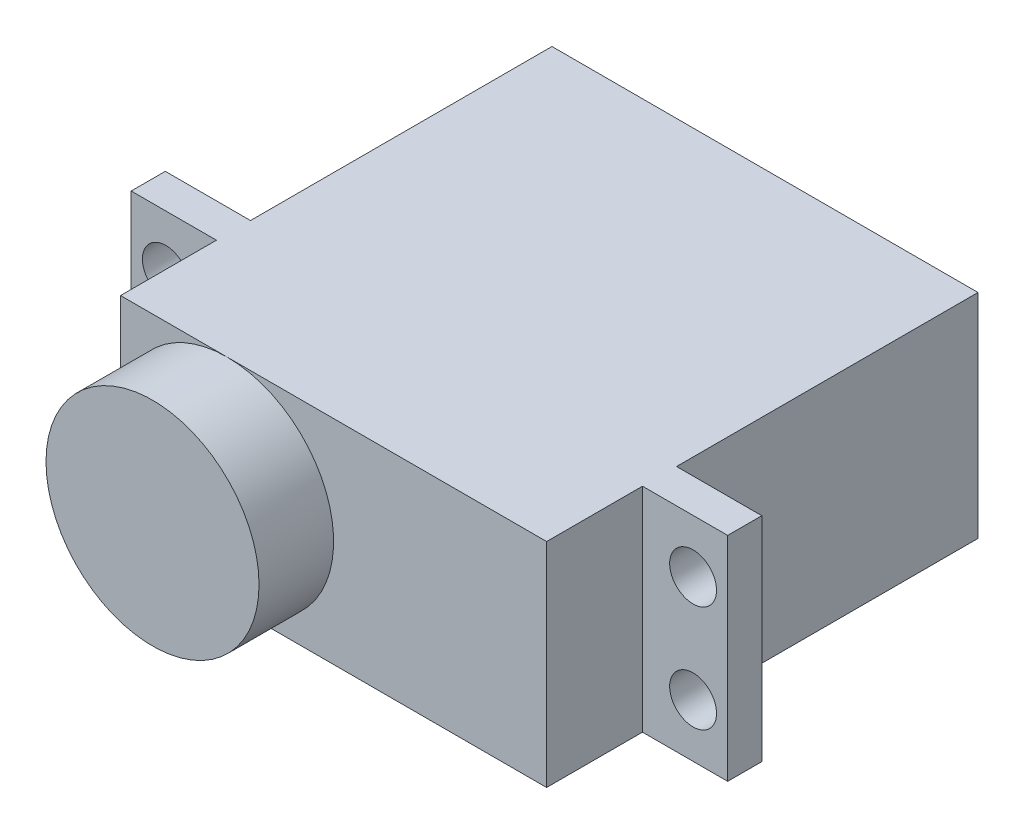
ISO-10303-21;
HEADER;
FILE_DESCRIPTION(('STEP AP214'),'2;1');
FILE_NAME('part.step','',(''),(''),'','','');
FILE_SCHEMA(('AUTOMOTIVE_DESIGN { 1 0 10303 214 1 1 1 1 }'));
ENDSEC;
DATA;
#1=APPLICATION_CONTEXT('core data for automotive mechanical design processes');
#2=APPLICATION_PROTOCOL_DEFINITION('international standard','automotive_design',2000,#1);
#3=PRODUCT_CONTEXT('',#1,'mechanical');
#4=PRODUCT('Part','Part','',(#3));
#5=PRODUCT_RELATED_PRODUCT_CATEGORY('part','',(#4));
#6=PRODUCT_DEFINITION_FORMATION('','',#4);
#7=PRODUCT_DEFINITION_CONTEXT('part definition',#1,'design');
#8=PRODUCT_DEFINITION('design','',#6,#7);
#9=PRODUCT_DEFINITION_SHAPE('','',#8);
#10=(LENGTH_UNIT() NAMED_UNIT(*) SI_UNIT(.MILLI.,.METRE.));
#11=(NAMED_UNIT(*) PLANE_ANGLE_UNIT() SI_UNIT($,.RADIAN.));
#12=(NAMED_UNIT(*) SI_UNIT($,.STERADIAN.) SOLID_ANGLE_UNIT());
#13=UNCERTAINTY_MEASURE_WITH_UNIT(LENGTH_MEASURE(1.E-05),#10,'distance_accuracy_value','');
#14=(GEOMETRIC_REPRESENTATION_CONTEXT(3) GLOBAL_UNCERTAINTY_ASSIGNED_CONTEXT((#13)) GLOBAL_UNIT_ASSIGNED_CONTEXT((#10,
#11,#12)) REPRESENTATION_CONTEXT('',''));
#15=CARTESIAN_POINT('',(0.,0.,0.));
#16=DIRECTION('',(0.,0.,1.));
#17=DIRECTION('',(1.,0.,0.));
#18=AXIS2_PLACEMENT_3D('',#15,#16,#17);
#19=CARTESIAN_POINT('',(20.,10.,-40.5));
#20=DIRECTION('',(-1.,0.,0.));
#21=DIRECTION('',(0.,0.,1.));
#22=AXIS2_PLACEMENT_3D('',#19,#20,#21);
#23=PLANE('',#22);
#24=DIRECTION('',(0.,-1.,0.));
#25=VECTOR('',#24,1.);
#26=CARTESIAN_POINT('',(20.,10.,-9.));
#27=LINE('',#26,#25);
#28=CARTESIAN_POINT('',(20.,10.,-9.));
#29=VERTEX_POINT('',#28);
#30=CARTESIAN_POINT('',(20.,-10.,-9.));
#31=VERTEX_POINT('',#30);
#32=EDGE_CURVE('E57',#29,#31,#27,.T.);
#33=ORIENTED_EDGE('',*,*,#32,.F.);
#34=DIRECTION('',(0.,0.,1.));
#35=VECTOR('',#34,1.);
#36=CARTESIAN_POINT('',(20.,10.,-40.5));
#37=LINE('',#36,#35);
#38=CARTESIAN_POINT('',(20.,10.,0.));
#39=VERTEX_POINT('',#38);
#40=EDGE_CURVE('E241',#29,#39,#37,.T.);
#41=ORIENTED_EDGE('',*,*,#40,.T.);
#42=DIRECTION('',(0.,-1.,0.));
#43=VECTOR('',#42,1.);
#44=CARTESIAN_POINT('',(20.,10.,0.));
#45=LINE('',#44,#43);
#46=CARTESIAN_POINT('',(20.,-10.,0.));
#47=VERTEX_POINT('',#46);
#48=EDGE_CURVE('E231',#39,#47,#45,.T.);
#49=ORIENTED_EDGE('',*,*,#48,.T.);
#50=DIRECTION('',(0.,0.,1.));
#51=VECTOR('',#50,1.);
#52=CARTESIAN_POINT('',(20.,-10.,-40.5));
#53=LINE('',#52,#51);
#54=EDGE_CURVE('E245',#31,#47,#53,.T.);
#55=ORIENTED_EDGE('',*,*,#54,.F.);
#56=EDGE_LOOP('',(#33,#41,#49,#55));
#57=FACE_BOUND('',#56,.T.);
#58=ADVANCED_FACE('F39',(#57),#23,.F.);
#59=CARTESIAN_POINT('',(-20.,10.,-40.5));
#60=DIRECTION('',(-1.,0.,0.));
#61=DIRECTION('',(0.,-1.,0.));
#62=AXIS2_PLACEMENT_3D('',#59,#60,#61);
#63=PLANE('',#62);
#64=DIRECTION('',(0.,0.,1.));
#65=VECTOR('',#64,1.);
#66=CARTESIAN_POINT('',(-20.,-10.,-40.5));
#67=LINE('',#66,#65);
#68=CARTESIAN_POINT('',(-20.,-10.,-40.5));
#69=VERTEX_POINT('',#68);
#70=CARTESIAN_POINT('',(-20.,-10.,-12.2));
#71=VERTEX_POINT('',#70);
#72=EDGE_CURVE('E246',#69,#71,#67,.T.);
#73=ORIENTED_EDGE('',*,*,#72,.T.);
#74=DIRECTION('',(0.,-1.,0.));
#75=VECTOR('',#74,1.);
#76=CARTESIAN_POINT('',(-20.,10.,-12.2));
#77=LINE('',#76,#75);
#78=CARTESIAN_POINT('',(-20.,10.,-12.2));
#79=VERTEX_POINT('',#78);
#80=EDGE_CURVE('E184',#79,#71,#77,.T.);
#81=ORIENTED_EDGE('',*,*,#80,.F.);
#82=DIRECTION('',(0.,0.,1.));
#83=VECTOR('',#82,1.);
#84=CARTESIAN_POINT('',(-20.,10.,-40.5));
#85=LINE('',#84,#83);
#86=CARTESIAN_POINT('',(-20.,10.,-40.5));
#87=VERTEX_POINT('',#86);
#88=EDGE_CURVE('E236',#87,#79,#85,.T.);
#89=ORIENTED_EDGE('',*,*,#88,.F.);
#90=DIRECTION('',(0.,-1.,0.));
#91=VECTOR('',#90,1.);
#92=CARTESIAN_POINT('',(-20.,10.,-40.5));
#93=LINE('',#92,#91);
#94=EDGE_CURVE('E212',#87,#69,#93,.T.);
#95=ORIENTED_EDGE('',*,*,#94,.T.);
#96=EDGE_LOOP('',(#73,#81,#89,#95));
#97=FACE_BOUND('',#96,.T.);
#98=ADVANCED_FACE('F326',(#97),#63,.T.);
#99=CARTESIAN_POINT('',(0.,0.,0.));
#100=DIRECTION('',(0.,0.,1.));
#101=DIRECTION('',(1.,0.,0.));
#102=AXIS2_PLACEMENT_3D('',#99,#100,#101);
#103=PLANE('',#102);
#104=CARTESIAN_POINT('',(-10.,0.,0.));
#105=DIRECTION('',(0.,0.,1.));
#106=DIRECTION('',(1.,0.,0.));
#107=AXIS2_PLACEMENT_3D('',#104,#105,#106);
#108=CIRCLE('',#107,10.);
#109=CARTESIAN_POINT('',(-10.,10.,0.));
#110=VERTEX_POINT('',#109);
#111=CARTESIAN_POINT('',(-20.,0.,0.));
#112=VERTEX_POINT('',#111);
#113=EDGE_CURVE('E50',#110,#112,#108,.T.);
#114=ORIENTED_EDGE('',*,*,#113,.F.);
#115=DIRECTION('',(1.,0.,0.));
#116=VECTOR('',#115,1.);
#117=CARTESIAN_POINT('',(-20.,10.,0.));
#118=LINE('',#117,#116);
#119=CARTESIAN_POINT('',(-20.,10.,0.));
#120=VERTEX_POINT('',#119);
#121=EDGE_CURVE('E216',#120,#110,#118,.T.);
#122=ORIENTED_EDGE('',*,*,#121,.F.);
#123=DIRECTION('',(0.,-1.,0.));
#124=VECTOR('',#123,1.);
#125=CARTESIAN_POINT('',(-20.,10.,0.));
#126=LINE('',#125,#124);
#127=EDGE_CURVE('E224',#120,#112,#126,.T.);
#128=ORIENTED_EDGE('',*,*,#127,.T.);
#129=EDGE_LOOP('',(#114,#122,#128));
#130=FACE_BOUND('',#129,.T.);
#131=ADVANCED_FACE('F308',(#130),#103,.T.);
#132=CARTESIAN_POINT('',(-10.,-10.,0.));
#133=VERTEX_POINT('',#132);
#134=EDGE_CURVE('E11',#112,#133,#108,.T.);
#135=ORIENTED_EDGE('',*,*,#134,.F.);
#136=CARTESIAN_POINT('',(-20.,-10.,0.));
#137=VERTEX_POINT('',#136);
#138=EDGE_CURVE('E209',#112,#137,#126,.T.);
#139=ORIENTED_EDGE('',*,*,#138,.T.);
#140=DIRECTION('',(1.,0.,0.));
#141=VECTOR('',#140,1.);
#142=CARTESIAN_POINT('',(-20.,-10.,0.));
#143=LINE('',#142,#141);
#144=EDGE_CURVE('E228',#137,#133,#143,.T.);
#145=ORIENTED_EDGE('',*,*,#144,.T.);
#146=EDGE_LOOP('',(#135,#139,#145));
#147=FACE_BOUND('',#146,.T.);
#148=ADVANCED_FACE('F302',(#147),#103,.T.);
#149=DIRECTION('',(0.,-1.,0.));
#150=VECTOR('',#149,1.);
#151=CARTESIAN_POINT('',(-20.,10.,-9.));
#152=LINE('',#151,#150);
#153=CARTESIAN_POINT('',(-20.,10.,-9.));
#154=VERTEX_POINT('',#153);
#155=CARTESIAN_POINT('',(-20.,-10.,-9.));
#156=VERTEX_POINT('',#155);
#157=EDGE_CURVE('E175',#154,#156,#152,.T.);
#158=ORIENTED_EDGE('',*,*,#157,.T.);
#159=EDGE_CURVE('E223',#156,#137,#67,.T.);
#160=ORIENTED_EDGE('',*,*,#159,.T.);
#161=ORIENTED_EDGE('',*,*,#138,.F.);
#162=ORIENTED_EDGE('',*,*,#127,.F.);
#163=EDGE_CURVE('E239',#154,#120,#85,.T.);
#164=ORIENTED_EDGE('',*,*,#163,.F.);
#165=EDGE_LOOP('',(#158,#160,#161,#162,#164));
#166=FACE_BOUND('',#165,.T.);
#167=ADVANCED_FACE('F41',(#166),#63,.T.);
#168=CARTESIAN_POINT('',(-20.,10.,-40.5));
#169=DIRECTION('',(0.,-1.,0.));
#170=DIRECTION('',(0.,0.,-1.));
#171=AXIS2_PLACEMENT_3D('',#168,#169,#170);
#172=PLANE('',#171);
#173=ORIENTED_EDGE('',*,*,#121,.T.);
#174=EDGE_CURVE('E234',#110,#39,#118,.T.);
#175=ORIENTED_EDGE('',*,*,#174,.T.);
#176=ORIENTED_EDGE('',*,*,#40,.F.);
#177=DIRECTION('',(-1.,0.,0.));
#178=VECTOR('',#177,1.);
#179=CARTESIAN_POINT('',(28.,10.,-9.));
#180=LINE('',#179,#178);
#181=CARTESIAN_POINT('',(28.,10.,-9.));
#182=VERTEX_POINT('',#181);
#183=EDGE_CURVE('E162',#182,#29,#180,.T.);
#184=ORIENTED_EDGE('',*,*,#183,.F.);
#185=DIRECTION('',(0.,0.,-1.));
#186=VECTOR('',#185,1.);
#187=CARTESIAN_POINT('',(28.,10.,-9.));
#188=LINE('',#187,#186);
#189=CARTESIAN_POINT('',(28.,10.,-12.2));
#190=VERTEX_POINT('',#189);
#191=EDGE_CURVE('E155',#182,#190,#188,.T.);
#192=ORIENTED_EDGE('',*,*,#191,.T.);
#193=DIRECTION('',(-1.,0.,0.));
#194=VECTOR('',#193,1.);
#195=CARTESIAN_POINT('',(28.,10.,-12.2));
#196=LINE('',#195,#194);
#197=CARTESIAN_POINT('',(20.,10.,-12.2));
#198=VERTEX_POINT('',#197);
#199=EDGE_CURVE('E141',#190,#198,#196,.T.);
#200=ORIENTED_EDGE('',*,*,#199,.T.);
#201=CARTESIAN_POINT('',(20.,10.,-40.5));
#202=VERTEX_POINT('',#201);
#203=EDGE_CURVE('E65',#202,#198,#37,.T.);
#204=ORIENTED_EDGE('',*,*,#203,.F.);
#205=DIRECTION('',(1.,0.,0.));
#206=VECTOR('',#205,1.);
#207=CARTESIAN_POINT('',(-20.,10.,-40.5));
#208=LINE('',#207,#206);
#209=EDGE_CURVE('E221',#87,#202,#208,.T.);
#210=ORIENTED_EDGE('',*,*,#209,.F.);
#211=ORIENTED_EDGE('',*,*,#88,.T.);
#212=DIRECTION('',(1.,0.,0.));
#213=VECTOR('',#212,1.);
#214=CARTESIAN_POINT('',(-28.,10.,-12.2));
#215=LINE('',#214,#213);
#216=CARTESIAN_POINT('',(-28.,10.,-12.2));
#217=VERTEX_POINT('',#216);
#218=EDGE_CURVE('E199',#217,#79,#215,.T.);
#219=ORIENTED_EDGE('',*,*,#218,.F.);
#220=DIRECTION('',(0.,0.,-1.));
#221=VECTOR('',#220,1.);
#222=CARTESIAN_POINT('',(-28.,10.,-9.));
#223=LINE('',#222,#221);
#224=CARTESIAN_POINT('',(-28.,10.,-9.));
#225=VERTEX_POINT('',#224);
#226=EDGE_CURVE('E189',#225,#217,#223,.T.);
#227=ORIENTED_EDGE('',*,*,#226,.F.);
#228=DIRECTION('',(1.,0.,0.));
#229=VECTOR('',#228,1.);
#230=CARTESIAN_POINT('',(-28.,10.,-9.));
#231=LINE('',#230,#229);
#232=EDGE_CURVE('E196',#225,#154,#231,.T.);
#233=ORIENTED_EDGE('',*,*,#232,.T.);
#234=ORIENTED_EDGE('',*,*,#163,.T.);
#235=EDGE_LOOP('',(#173,#175,#176,#184,#192,#200,#204,#210,#211,#219,#227,#233,#234));
#236=FACE_BOUND('',#235,.T.);
#237=ADVANCED_FACE('F160',(#236),#172,.F.);
#238=ORIENTED_EDGE('',*,*,#203,.T.);
#239=DIRECTION('',(0.,-1.,0.));
#240=VECTOR('',#239,1.);
#241=CARTESIAN_POINT('',(20.,10.,-12.2));
#242=LINE('',#241,#240);
#243=CARTESIAN_POINT('',(20.,-10.,-12.2));
#244=VERTEX_POINT('',#243);
#245=EDGE_CURVE('E146',#198,#244,#242,.T.);
#246=ORIENTED_EDGE('',*,*,#245,.T.);
#247=CARTESIAN_POINT('',(20.,-10.,-40.5));
#248=VERTEX_POINT('',#247);
#249=EDGE_CURVE('E242',#248,#244,#53,.T.);
#250=ORIENTED_EDGE('',*,*,#249,.F.);
#251=DIRECTION('',(0.,-1.,0.));
#252=VECTOR('',#251,1.);
#253=CARTESIAN_POINT('',(20.,10.,-40.5));
#254=LINE('',#253,#252);
#255=EDGE_CURVE('E219',#202,#248,#254,.T.);
#256=ORIENTED_EDGE('',*,*,#255,.F.);
#257=EDGE_LOOP('',(#238,#246,#250,#256));
#258=FACE_BOUND('',#257,.T.);
#259=ADVANCED_FACE('F319',(#258),#23,.F.);
#260=CARTESIAN_POINT('',(-20.,-10.,-40.5));
#261=DIRECTION('',(0.,-1.,0.));
#262=DIRECTION('',(0.,0.,-1.));
#263=AXIS2_PLACEMENT_3D('',#260,#261,#262);
#264=PLANE('',#263);
#265=ORIENTED_EDGE('',*,*,#144,.F.);
#266=ORIENTED_EDGE('',*,*,#159,.F.);
#267=DIRECTION('',(1.,0.,0.));
#268=VECTOR('',#267,1.);
#269=CARTESIAN_POINT('',(-28.,-10.,-9.));
#270=LINE('',#269,#268);
#271=CARTESIAN_POINT('',(-28.,-10.,-9.));
#272=VERTEX_POINT('',#271);
#273=EDGE_CURVE('E191',#272,#156,#270,.T.);
#274=ORIENTED_EDGE('',*,*,#273,.F.);
#275=DIRECTION('',(0.,0.,-1.));
#276=VECTOR('',#275,1.);
#277=CARTESIAN_POINT('',(-28.,-10.,-9.));
#278=LINE('',#277,#276);
#279=CARTESIAN_POINT('',(-28.,-10.,-12.2));
#280=VERTEX_POINT('',#279);
#281=EDGE_CURVE('E183',#272,#280,#278,.T.);
#282=ORIENTED_EDGE('',*,*,#281,.T.);
#283=DIRECTION('',(1.,0.,0.));
#284=VECTOR('',#283,1.);
#285=CARTESIAN_POINT('',(-28.,-10.,-12.2));
#286=LINE('',#285,#284);
#287=EDGE_CURVE('E202',#280,#71,#286,.T.);
#288=ORIENTED_EDGE('',*,*,#287,.T.);
#289=ORIENTED_EDGE('',*,*,#72,.F.);
#290=DIRECTION('',(1.,0.,0.));
#291=VECTOR('',#290,1.);
#292=CARTESIAN_POINT('',(-20.,-10.,-40.5));
#293=LINE('',#292,#291);
#294=EDGE_CURVE('E215',#69,#248,#293,.T.);
#295=ORIENTED_EDGE('',*,*,#294,.T.);
#296=ORIENTED_EDGE('',*,*,#249,.T.);
#297=DIRECTION('',(-1.,0.,0.));
#298=VECTOR('',#297,1.);
#299=CARTESIAN_POINT('',(28.,-10.,-12.2));
#300=LINE('',#299,#298);
#301=CARTESIAN_POINT('',(28.,-10.,-12.2));
#302=VERTEX_POINT('',#301);
#303=EDGE_CURVE('E149',#302,#244,#300,.T.);
#304=ORIENTED_EDGE('',*,*,#303,.F.);
#305=DIRECTION('',(0.,0.,-1.));
#306=VECTOR('',#305,1.);
#307=CARTESIAN_POINT('',(28.,-10.,-9.));
#308=LINE('',#307,#306);
#309=CARTESIAN_POINT('',(28.,-10.,-9.));
#310=VERTEX_POINT('',#309);
#311=EDGE_CURVE('E157',#310,#302,#308,.T.);
#312=ORIENTED_EDGE('',*,*,#311,.F.);
#313=DIRECTION('',(-1.,0.,0.));
#314=VECTOR('',#313,1.);
#315=CARTESIAN_POINT('',(28.,-10.,-9.));
#316=LINE('',#315,#314);
#317=EDGE_CURVE('E176',#310,#31,#316,.T.);
#318=ORIENTED_EDGE('',*,*,#317,.T.);
#319=ORIENTED_EDGE('',*,*,#54,.T.);
#320=EDGE_CURVE('E227',#133,#47,#143,.T.);
#321=ORIENTED_EDGE('',*,*,#320,.F.);
#322=EDGE_LOOP('',(#265,#266,#274,#282,#288,#289,#295,#296,#304,#312,#318,#319,#321));
#323=FACE_BOUND('',#322,.T.);
#324=ADVANCED_FACE('F298',(#323),#264,.T.);
#325=CARTESIAN_POINT('',(0.,0.,-40.5));
#326=DIRECTION('',(0.,0.,1.));
#327=DIRECTION('',(1.,0.,0.));
#328=AXIS2_PLACEMENT_3D('',#325,#326,#327);
#329=PLANE('',#328);
#330=ORIENTED_EDGE('',*,*,#94,.F.);
#331=ORIENTED_EDGE('',*,*,#209,.T.);
#332=ORIENTED_EDGE('',*,*,#255,.T.);
#333=ORIENTED_EDGE('',*,*,#294,.F.);
#334=EDGE_LOOP('',(#330,#331,#332,#333));
#335=FACE_BOUND('',#334,.T.);
#336=ADVANCED_FACE('F322',(#335),#329,.F.);
#337=EDGE_CURVE('E48',#133,#110,#108,.T.);
#338=ORIENTED_EDGE('',*,*,#337,.F.);
#339=ORIENTED_EDGE('',*,*,#320,.T.);
#340=ORIENTED_EDGE('',*,*,#48,.F.);
#341=ORIENTED_EDGE('',*,*,#174,.F.);
#342=EDGE_LOOP('',(#338,#339,#340,#341));
#343=FACE_BOUND('',#342,.T.);
#344=ADVANCED_FACE('F313',(#343),#103,.T.);
#345=CARTESIAN_POINT('',(-10.,0.,7.));
#346=DIRECTION('',(0.,0.,-1.));
#347=DIRECTION('',(-1.,0.,0.));
#348=AXIS2_PLACEMENT_3D('',#345,#346,#347);
#349=CYLINDRICAL_SURFACE('',#348,10.);
#350=CARTESIAN_POINT('',(-10.,0.,7.));
#351=DIRECTION('',(0.,0.,1.));
#352=DIRECTION('',(1.,0.,0.));
#353=AXIS2_PLACEMENT_3D('',#350,#351,#352);
#354=CIRCLE('',#353,10.);
#355=CARTESIAN_POINT('',(0.,0.,7.));
#356=VERTEX_POINT('',#355);
#357=EDGE_CURVE('E207',#356,#356,#354,.T.);
#358=ORIENTED_EDGE('',*,*,#357,.F.);
#359=EDGE_LOOP('',(#358));
#360=FACE_BOUND('',#359,.T.);
#361=ORIENTED_EDGE('',*,*,#113,.T.);
#362=ORIENTED_EDGE('',*,*,#134,.T.);
#363=ORIENTED_EDGE('',*,*,#337,.T.);
#364=EDGE_LOOP('',(#361,#362,#363));
#365=FACE_BOUND('',#364,.T.);
#366=ADVANCED_FACE('F305',(#360,#365),#349,.T.);
#367=CARTESIAN_POINT('',(-10.,0.,7.));
#368=DIRECTION('',(0.,0.,1.));
#369=DIRECTION('',(1.,0.,0.));
#370=AXIS2_PLACEMENT_3D('',#367,#368,#369);
#371=PLANE('',#370);
#372=ORIENTED_EDGE('',*,*,#357,.T.);
#373=EDGE_LOOP('',(#372));
#374=FACE_BOUND('',#373,.T.);
#375=ADVANCED_FACE('F279',(#374),#371,.T.);
#376=CARTESIAN_POINT('',(-28.,10.,-9.));
#377=DIRECTION('',(0.,0.,1.));
#378=DIRECTION('',(0.,-1.,0.));
#379=AXIS2_PLACEMENT_3D('',#376,#377,#378);
#380=PLANE('',#379);
#381=CARTESIAN_POINT('',(-24.75,5.,-9.));
#382=DIRECTION('',(0.,0.,1.));
#383=DIRECTION('',(1.,0.,0.));
#384=AXIS2_PLACEMENT_3D('',#381,#382,#383);
#385=CIRCLE('',#384,2.2);
#386=CARTESIAN_POINT('',(-22.55,5.,-9.));
#387=VERTEX_POINT('',#386);
#388=EDGE_CURVE('E251',#387,#387,#385,.T.);
#389=ORIENTED_EDGE('',*,*,#388,.F.);
#390=EDGE_LOOP('',(#389));
#391=FACE_BOUND('',#390,.T.);
#392=CARTESIAN_POINT('',(-24.75,-5.,-9.));
#393=DIRECTION('',(0.,0.,1.));
#394=DIRECTION('',(1.,0.,0.));
#395=AXIS2_PLACEMENT_3D('',#392,#393,#394);
#396=CIRCLE('',#395,2.2);
#397=CARTESIAN_POINT('',(-22.55,-5.,-9.));
#398=VERTEX_POINT('',#397);
#399=EDGE_CURVE('E167',#398,#398,#396,.T.);
#400=ORIENTED_EDGE('',*,*,#399,.F.);
#401=EDGE_LOOP('',(#400));
#402=FACE_BOUND('',#401,.T.);
#403=ORIENTED_EDGE('',*,*,#157,.F.);
#404=ORIENTED_EDGE('',*,*,#232,.F.);
#405=DIRECTION('',(0.,-1.,0.));
#406=VECTOR('',#405,1.);
#407=CARTESIAN_POINT('',(-28.,10.,-9.));
#408=LINE('',#407,#406);
#409=EDGE_CURVE('E180',#225,#272,#408,.T.);
#410=ORIENTED_EDGE('',*,*,#409,.T.);
#411=ORIENTED_EDGE('',*,*,#273,.T.);
#412=EDGE_LOOP('',(#403,#404,#410,#411));
#413=FACE_BOUND('',#412,.T.);
#414=ADVANCED_FACE('F275',(#391,#402,#413),#380,.T.);
#415=CARTESIAN_POINT('',(-28.,10.,-12.2));
#416=DIRECTION('',(0.,0.,1.));
#417=DIRECTION('',(0.,-1.,0.));
#418=AXIS2_PLACEMENT_3D('',#415,#416,#417);
#419=PLANE('',#418);
#420=CARTESIAN_POINT('',(-24.75,5.,-12.2));
#421=DIRECTION('',(0.,0.,1.));
#422=DIRECTION('',(0.,-1.,0.));
#423=AXIS2_PLACEMENT_3D('',#420,#421,#422);
#424=CIRCLE('',#423,2.2);
#425=CARTESIAN_POINT('',(-24.75,2.8,-12.2));
#426=VERTEX_POINT('',#425);
#427=EDGE_CURVE('E172',#426,#426,#424,.T.);
#428=ORIENTED_EDGE('',*,*,#427,.T.);
#429=EDGE_LOOP('',(#428));
#430=FACE_BOUND('',#429,.T.);
#431=CARTESIAN_POINT('',(-24.75,-5.,-12.2));
#432=DIRECTION('',(0.,0.,1.));
#433=DIRECTION('',(0.,-1.,0.));
#434=AXIS2_PLACEMENT_3D('',#431,#432,#433);
#435=CIRCLE('',#434,2.2);
#436=CARTESIAN_POINT('',(-24.75,-7.2,-12.2));
#437=VERTEX_POINT('',#436);
#438=EDGE_CURVE('E248',#437,#437,#435,.T.);
#439=ORIENTED_EDGE('',*,*,#438,.T.);
#440=EDGE_LOOP('',(#439));
#441=FACE_BOUND('',#440,.T.);
#442=ORIENTED_EDGE('',*,*,#80,.T.);
#443=ORIENTED_EDGE('',*,*,#287,.F.);
#444=DIRECTION('',(0.,-1.,0.));
#445=VECTOR('',#444,1.);
#446=CARTESIAN_POINT('',(-28.,10.,-12.2));
#447=LINE('',#446,#445);
#448=EDGE_CURVE('E187',#217,#280,#447,.T.);
#449=ORIENTED_EDGE('',*,*,#448,.F.);
#450=ORIENTED_EDGE('',*,*,#218,.T.);
#451=EDGE_LOOP('',(#442,#443,#449,#450));
#452=FACE_BOUND('',#451,.T.);
#453=ADVANCED_FACE('F278',(#430,#441,#452),#419,.F.);
#454=CARTESIAN_POINT('',(-28.,0.,0.));
#455=DIRECTION('',(1.,0.,0.));
#456=DIRECTION('',(0.,1.,0.));
#457=AXIS2_PLACEMENT_3D('',#454,#455,#456);
#458=PLANE('',#457);
#459=ORIENTED_EDGE('',*,*,#409,.F.);
#460=ORIENTED_EDGE('',*,*,#226,.T.);
#461=ORIENTED_EDGE('',*,*,#448,.T.);
#462=ORIENTED_EDGE('',*,*,#281,.F.);
#463=EDGE_LOOP('',(#459,#460,#461,#462));
#464=FACE_BOUND('',#463,.T.);
#465=ADVANCED_FACE('F294',(#464),#458,.F.);
#466=CARTESIAN_POINT('',(28.,10.,-9.));
#467=DIRECTION('',(0.,0.,-1.));
#468=DIRECTION('',(0.,1.,0.));
#469=AXIS2_PLACEMENT_3D('',#466,#467,#468);
#470=PLANE('',#469);
#471=CARTESIAN_POINT('',(24.75,5.,-9.));
#472=DIRECTION('',(0.,0.,1.));
#473=DIRECTION('',(1.,0.,0.));
#474=AXIS2_PLACEMENT_3D('',#471,#472,#473);
#475=CIRCLE('',#474,2.2);
#476=CARTESIAN_POINT('',(26.95,5.,-9.));
#477=VERTEX_POINT('',#476);
#478=EDGE_CURVE('E255',#477,#477,#475,.T.);
#479=ORIENTED_EDGE('',*,*,#478,.F.);
#480=EDGE_LOOP('',(#479));
#481=FACE_BOUND('',#480,.T.);
#482=CARTESIAN_POINT('',(24.75,-5.,-9.));
#483=DIRECTION('',(0.,0.,1.));
#484=DIRECTION('',(1.,0.,0.));
#485=AXIS2_PLACEMENT_3D('',#482,#483,#484);
#486=CIRCLE('',#485,2.2);
#487=CARTESIAN_POINT('',(26.95,-5.,-9.));
#488=VERTEX_POINT('',#487);
#489=EDGE_CURVE('E260',#488,#488,#486,.T.);
#490=ORIENTED_EDGE('',*,*,#489,.F.);
#491=EDGE_LOOP('',(#490));
#492=FACE_BOUND('',#491,.T.);
#493=ORIENTED_EDGE('',*,*,#32,.T.);
#494=ORIENTED_EDGE('',*,*,#317,.F.);
#495=DIRECTION('',(0.,-1.,0.));
#496=VECTOR('',#495,1.);
#497=CARTESIAN_POINT('',(28.,10.,-9.));
#498=LINE('',#497,#496);
#499=EDGE_CURVE('E150',#182,#310,#498,.T.);
#500=ORIENTED_EDGE('',*,*,#499,.F.);
#501=ORIENTED_EDGE('',*,*,#183,.T.);
#502=EDGE_LOOP('',(#493,#494,#500,#501));
#503=FACE_BOUND('',#502,.T.);
#504=ADVANCED_FACE('F315',(#481,#492,#503),#470,.F.);
#505=CARTESIAN_POINT('',(28.,10.,-12.2));
#506=DIRECTION('',(0.,0.,-1.));
#507=DIRECTION('',(0.,1.,0.));
#508=AXIS2_PLACEMENT_3D('',#505,#506,#507);
#509=PLANE('',#508);
#510=CARTESIAN_POINT('',(24.75,5.,-12.2));
#511=DIRECTION('',(0.,0.,-1.));
#512=DIRECTION('',(0.,1.,0.));
#513=AXIS2_PLACEMENT_3D('',#510,#511,#512);
#514=CIRCLE('',#513,2.2);
#515=CARTESIAN_POINT('',(24.75,7.2,-12.2));
#516=VERTEX_POINT('',#515);
#517=EDGE_CURVE('E43',#516,#516,#514,.T.);
#518=ORIENTED_EDGE('',*,*,#517,.F.);
#519=EDGE_LOOP('',(#518));
#520=FACE_BOUND('',#519,.T.);
#521=CARTESIAN_POINT('',(24.75,-5.,-12.2));
#522=DIRECTION('',(0.,0.,-1.));
#523=DIRECTION('',(0.,1.,0.));
#524=AXIS2_PLACEMENT_3D('',#521,#522,#523);
#525=CIRCLE('',#524,2.2);
#526=CARTESIAN_POINT('',(24.75,-2.8,-12.2));
#527=VERTEX_POINT('',#526);
#528=EDGE_CURVE('E253',#527,#527,#525,.T.);
#529=ORIENTED_EDGE('',*,*,#528,.F.);
#530=EDGE_LOOP('',(#529));
#531=FACE_BOUND('',#530,.T.);
#532=ORIENTED_EDGE('',*,*,#245,.F.);
#533=ORIENTED_EDGE('',*,*,#199,.F.);
#534=DIRECTION('',(0.,-1.,0.));
#535=VECTOR('',#534,1.);
#536=CARTESIAN_POINT('',(28.,10.,-12.2));
#537=LINE('',#536,#535);
#538=EDGE_CURVE('E145',#190,#302,#537,.T.);
#539=ORIENTED_EDGE('',*,*,#538,.T.);
#540=ORIENTED_EDGE('',*,*,#303,.T.);
#541=EDGE_LOOP('',(#532,#533,#539,#540));
#542=FACE_BOUND('',#541,.T.);
#543=ADVANCED_FACE('F143',(#520,#531,#542),#509,.T.);
#544=CARTESIAN_POINT('',(28.,0.,0.));
#545=DIRECTION('',(-1.,0.,0.));
#546=DIRECTION('',(0.,0.,1.));
#547=AXIS2_PLACEMENT_3D('',#544,#545,#546);
#548=PLANE('',#547);
#549=ORIENTED_EDGE('',*,*,#191,.F.);
#550=ORIENTED_EDGE('',*,*,#499,.T.);
#551=ORIENTED_EDGE('',*,*,#311,.T.);
#552=ORIENTED_EDGE('',*,*,#538,.F.);
#553=EDGE_LOOP('',(#549,#550,#551,#552));
#554=FACE_BOUND('',#553,.T.);
#555=ADVANCED_FACE('F154',(#554),#548,.F.);
#556=CARTESIAN_POINT('',(-24.75,-5.,-17.));
#557=DIRECTION('',(0.,0.,1.));
#558=DIRECTION('',(1.,0.,0.));
#559=AXIS2_PLACEMENT_3D('',#556,#557,#558);
#560=CYLINDRICAL_SURFACE('',#559,2.2);
#561=ORIENTED_EDGE('',*,*,#399,.T.);
#562=EDGE_LOOP('',(#561));
#563=FACE_BOUND('',#562,.T.);
#564=ORIENTED_EDGE('',*,*,#438,.F.);
#565=EDGE_LOOP('',(#564));
#566=FACE_BOUND('',#565,.T.);
#567=ADVANCED_FACE('F272',(#563,#566),#560,.F.);
#568=CARTESIAN_POINT('',(-24.75,5.,-17.));
#569=DIRECTION('',(0.,0.,1.));
#570=DIRECTION('',(1.,0.,0.));
#571=AXIS2_PLACEMENT_3D('',#568,#569,#570);
#572=CYLINDRICAL_SURFACE('',#571,2.2);
#573=ORIENTED_EDGE('',*,*,#388,.T.);
#574=EDGE_LOOP('',(#573));
#575=FACE_BOUND('',#574,.T.);
#576=ORIENTED_EDGE('',*,*,#427,.F.);
#577=EDGE_LOOP('',(#576));
#578=FACE_BOUND('',#577,.T.);
#579=ADVANCED_FACE('F372',(#575,#578),#572,.F.);
#580=CARTESIAN_POINT('',(24.75,-5.,-17.));
#581=DIRECTION('',(0.,0.,1.));
#582=DIRECTION('',(1.,0.,0.));
#583=AXIS2_PLACEMENT_3D('',#580,#581,#582);
#584=CYLINDRICAL_SURFACE('',#583,2.2);
#585=ORIENTED_EDGE('',*,*,#528,.T.);
#586=EDGE_LOOP('',(#585));
#587=FACE_BOUND('',#586,.T.);
#588=ORIENTED_EDGE('',*,*,#489,.T.);
#589=EDGE_LOOP('',(#588));
#590=FACE_BOUND('',#589,.T.);
#591=ADVANCED_FACE('F375',(#587,#590),#584,.F.);
#592=CARTESIAN_POINT('',(24.75,5.,-17.));
#593=DIRECTION('',(0.,0.,1.));
#594=DIRECTION('',(1.,0.,0.));
#595=AXIS2_PLACEMENT_3D('',#592,#593,#594);
#596=CYLINDRICAL_SURFACE('',#595,2.2);
#597=ORIENTED_EDGE('',*,*,#517,.T.);
#598=EDGE_LOOP('',(#597));
#599=FACE_BOUND('',#598,.T.);
#600=ORIENTED_EDGE('',*,*,#478,.T.);
#601=EDGE_LOOP('',(#600));
#602=FACE_BOUND('',#601,.T.);
#603=ADVANCED_FACE('F378',(#599,#602),#596,.F.);
#604=CLOSED_SHELL('',(#58,#98,#131,#148,#167,#237,#259,#324,#336,#344,#366,#375,#414,#453,#465,
#504,#543,#555,#567,#579,#591,#603));
#605=MANIFOLD_SOLID_BREP('B2',#604);
#606=ADVANCED_BREP_SHAPE_REPRESENTATION('',(#18,#605),#14);
#607=SHAPE_DEFINITION_REPRESENTATION(#9,#606);
ENDSEC;
END-ISO-10303-21;
